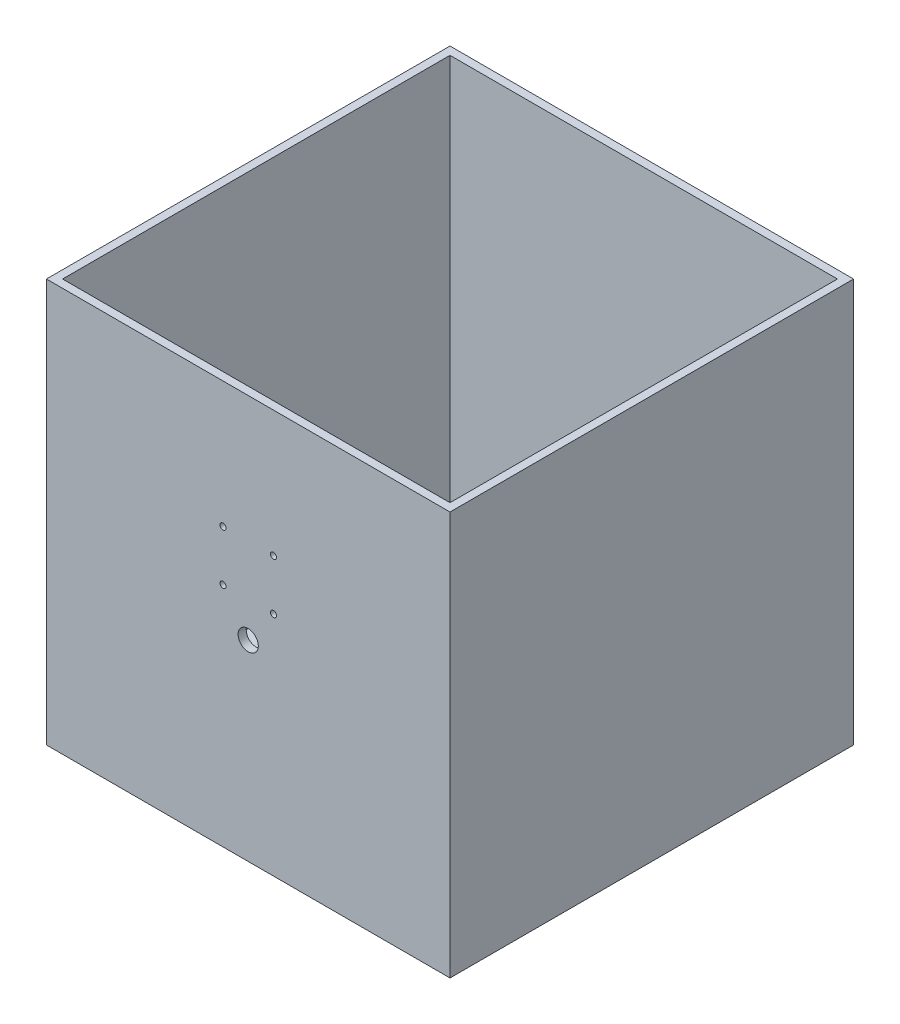
ISO-10303-21;
HEADER;
FILE_DESCRIPTION(('STEP AP214'),'2;1');
FILE_NAME('part.step','',(''),(''),'','','');
FILE_SCHEMA(('AUTOMOTIVE_DESIGN { 1 0 10303 214 1 1 1 1 }'));
ENDSEC;
DATA;
#1=APPLICATION_CONTEXT('core data for automotive mechanical design processes');
#2=APPLICATION_PROTOCOL_DEFINITION('international standard','automotive_design',2000,#1);
#3=PRODUCT_CONTEXT('',#1,'mechanical');
#4=PRODUCT('Part','Part','',(#3));
#5=PRODUCT_RELATED_PRODUCT_CATEGORY('part','',(#4));
#6=PRODUCT_DEFINITION_FORMATION('','',#4);
#7=PRODUCT_DEFINITION_CONTEXT('part definition',#1,'design');
#8=PRODUCT_DEFINITION('design','',#6,#7);
#9=PRODUCT_DEFINITION_SHAPE('','',#8);
#10=(LENGTH_UNIT() NAMED_UNIT(*) SI_UNIT(.MILLI.,.METRE.));
#11=(NAMED_UNIT(*) PLANE_ANGLE_UNIT() SI_UNIT($,.RADIAN.));
#12=(NAMED_UNIT(*) SI_UNIT($,.STERADIAN.) SOLID_ANGLE_UNIT());
#13=UNCERTAINTY_MEASURE_WITH_UNIT(LENGTH_MEASURE(1.E-05),#10,'distance_accuracy_value','');
#14=(GEOMETRIC_REPRESENTATION_CONTEXT(3) GLOBAL_UNCERTAINTY_ASSIGNED_CONTEXT((#13)) GLOBAL_UNIT_ASSIGNED_CONTEXT((#10,
#11,#12)) REPRESENTATION_CONTEXT('',''));
#15=CARTESIAN_POINT('',(0.,0.,0.));
#16=DIRECTION('',(0.,0.,1.));
#17=DIRECTION('',(1.,0.,0.));
#18=AXIS2_PLACEMENT_3D('',#15,#16,#17);
#19=CARTESIAN_POINT('',(0.,200.,0.));
#20=DIRECTION('',(0.,-1.,0.));
#21=DIRECTION('',(0.,0.,-1.));
#22=AXIS2_PLACEMENT_3D('',#19,#20,#21);
#23=PLANE('',#22);
#24=DIRECTION('',(0.,0.,-1.));
#25=VECTOR('',#24,1.);
#26=CARTESIAN_POINT('',(100.,200.,100.));
#27=LINE('',#26,#25);
#28=CARTESIAN_POINT('',(100.,200.,100.));
#29=VERTEX_POINT('',#28);
#30=CARTESIAN_POINT('',(100.,200.,-100.));
#31=VERTEX_POINT('',#30);
#32=EDGE_CURVE('E141',#29,#31,#27,.T.);
#33=ORIENTED_EDGE('',*,*,#32,.T.);
#34=DIRECTION('',(-1.,0.,0.));
#35=VECTOR('',#34,1.);
#36=CARTESIAN_POINT('',(-100.,200.,-100.));
#37=LINE('',#36,#35);
#38=CARTESIAN_POINT('',(-100.,200.,-100.));
#39=VERTEX_POINT('',#38);
#40=EDGE_CURVE('E85',#31,#39,#37,.T.);
#41=ORIENTED_EDGE('',*,*,#40,.T.);
#42=DIRECTION('',(0.,0.,1.));
#43=VECTOR('',#42,1.);
#44=CARTESIAN_POINT('',(-100.,200.,100.));
#45=LINE('',#44,#43);
#46=CARTESIAN_POINT('',(-100.,200.,100.));
#47=VERTEX_POINT('',#46);
#48=EDGE_CURVE('E144',#39,#47,#45,.T.);
#49=ORIENTED_EDGE('',*,*,#48,.T.);
#50=DIRECTION('',(1.,0.,0.));
#51=VECTOR('',#50,1.);
#52=CARTESIAN_POINT('',(-100.,200.,100.));
#53=LINE('',#52,#51);
#54=EDGE_CURVE('E57',#47,#29,#53,.T.);
#55=ORIENTED_EDGE('',*,*,#54,.T.);
#56=EDGE_LOOP('',(#33,#41,#49,#55));
#57=FACE_BOUND('',#56,.T.);
#58=DIRECTION('',(0.,0.,-1.));
#59=VECTOR('',#58,1.);
#60=CARTESIAN_POINT('',(96.,200.,0.));
#61=LINE('',#60,#59);
#62=CARTESIAN_POINT('',(96.,200.,96.));
#63=VERTEX_POINT('',#62);
#64=CARTESIAN_POINT('',(96.,200.,-96.));
#65=VERTEX_POINT('',#64);
#66=EDGE_CURVE('E130',#63,#65,#61,.T.);
#67=ORIENTED_EDGE('',*,*,#66,.F.);
#68=DIRECTION('',(1.,0.,0.));
#69=VECTOR('',#68,1.);
#70=CARTESIAN_POINT('',(0.,200.,96.));
#71=LINE('',#70,#69);
#72=CARTESIAN_POINT('',(-96.,200.,96.));
#73=VERTEX_POINT('',#72);
#74=EDGE_CURVE('E139',#73,#63,#71,.T.);
#75=ORIENTED_EDGE('',*,*,#74,.F.);
#76=DIRECTION('',(0.,0.,1.));
#77=VECTOR('',#76,1.);
#78=CARTESIAN_POINT('',(-96.,200.,0.));
#79=LINE('',#78,#77);
#80=CARTESIAN_POINT('',(-96.,200.,-96.));
#81=VERTEX_POINT('',#80);
#82=EDGE_CURVE('E137',#81,#73,#79,.T.);
#83=ORIENTED_EDGE('',*,*,#82,.F.);
#84=DIRECTION('',(-1.,0.,0.));
#85=VECTOR('',#84,1.);
#86=CARTESIAN_POINT('',(0.,200.,-96.));
#87=LINE('',#86,#85);
#88=EDGE_CURVE('E122',#65,#81,#87,.T.);
#89=ORIENTED_EDGE('',*,*,#88,.F.);
#90=EDGE_LOOP('',(#67,#75,#83,#89));
#91=FACE_BOUND('',#90,.T.);
#92=ADVANCED_FACE('F33',(#57,#91),#23,.F.);
#93=CARTESIAN_POINT('',(100.,200.,100.));
#94=DIRECTION('',(-1.,0.,0.));
#95=DIRECTION('',(0.,0.,1.));
#96=AXIS2_PLACEMENT_3D('',#93,#94,#95);
#97=PLANE('',#96);
#98=DIRECTION('',(0.,0.,-1.));
#99=VECTOR('',#98,1.);
#100=CARTESIAN_POINT('',(100.,0.,100.));
#101=LINE('',#100,#99);
#102=CARTESIAN_POINT('',(100.,0.,100.));
#103=VERTEX_POINT('',#102);
#104=CARTESIAN_POINT('',(100.,0.,-100.));
#105=VERTEX_POINT('',#104);
#106=EDGE_CURVE('E148',#103,#105,#101,.T.);
#107=ORIENTED_EDGE('',*,*,#106,.T.);
#108=DIRECTION('',(0.,-1.,0.));
#109=VECTOR('',#108,1.);
#110=CARTESIAN_POINT('',(100.,200.,-100.));
#111=LINE('',#110,#109);
#112=EDGE_CURVE('E11',#31,#105,#111,.T.);
#113=ORIENTED_EDGE('',*,*,#112,.F.);
#114=ORIENTED_EDGE('',*,*,#32,.F.);
#115=DIRECTION('',(0.,-1.,0.));
#116=VECTOR('',#115,1.);
#117=CARTESIAN_POINT('',(100.,200.,100.));
#118=LINE('',#117,#116);
#119=EDGE_CURVE('E147',#29,#103,#118,.T.);
#120=ORIENTED_EDGE('',*,*,#119,.T.);
#121=EDGE_LOOP('',(#107,#113,#114,#120));
#122=FACE_BOUND('',#121,.T.);
#123=ADVANCED_FACE('F35',(#122),#97,.F.);
#124=CARTESIAN_POINT('',(-100.,200.,-100.));
#125=DIRECTION('',(0.,0.,1.));
#126=DIRECTION('',(1.,0.,0.));
#127=AXIS2_PLACEMENT_3D('',#124,#125,#126);
#128=PLANE('',#127);
#129=DIRECTION('',(-1.,0.,0.));
#130=VECTOR('',#129,1.);
#131=CARTESIAN_POINT('',(-100.,0.,-100.));
#132=LINE('',#131,#130);
#133=CARTESIAN_POINT('',(-100.,0.,-100.));
#134=VERTEX_POINT('',#133);
#135=EDGE_CURVE('E151',#105,#134,#132,.T.);
#136=ORIENTED_EDGE('',*,*,#135,.T.);
#137=DIRECTION('',(0.,-1.,0.));
#138=VECTOR('',#137,1.);
#139=CARTESIAN_POINT('',(-100.,200.,-100.));
#140=LINE('',#139,#138);
#141=EDGE_CURVE('E41',#39,#134,#140,.T.);
#142=ORIENTED_EDGE('',*,*,#141,.F.);
#143=ORIENTED_EDGE('',*,*,#40,.F.);
#144=ORIENTED_EDGE('',*,*,#112,.T.);
#145=EDGE_LOOP('',(#136,#142,#143,#144));
#146=FACE_BOUND('',#145,.T.);
#147=ADVANCED_FACE('F182',(#146),#128,.F.);
#148=CARTESIAN_POINT('',(-100.,200.,100.));
#149=DIRECTION('',(1.,0.,0.));
#150=DIRECTION('',(0.,0.,-1.));
#151=AXIS2_PLACEMENT_3D('',#148,#149,#150);
#152=PLANE('',#151);
#153=DIRECTION('',(0.,0.,1.));
#154=VECTOR('',#153,1.);
#155=CARTESIAN_POINT('',(-100.,0.,100.));
#156=LINE('',#155,#154);
#157=CARTESIAN_POINT('',(-100.,0.,100.));
#158=VERTEX_POINT('',#157);
#159=EDGE_CURVE('E153',#134,#158,#156,.T.);
#160=ORIENTED_EDGE('',*,*,#159,.T.);
#161=DIRECTION('',(0.,-1.,0.));
#162=VECTOR('',#161,1.);
#163=CARTESIAN_POINT('',(-100.,200.,100.));
#164=LINE('',#163,#162);
#165=EDGE_CURVE('E157',#47,#158,#164,.T.);
#166=ORIENTED_EDGE('',*,*,#165,.F.);
#167=ORIENTED_EDGE('',*,*,#48,.F.);
#168=ORIENTED_EDGE('',*,*,#141,.T.);
#169=EDGE_LOOP('',(#160,#166,#167,#168));
#170=FACE_BOUND('',#169,.T.);
#171=ADVANCED_FACE('F162',(#170),#152,.F.);
#172=CARTESIAN_POINT('',(-100.,200.,100.));
#173=DIRECTION('',(0.,0.,-1.));
#174=DIRECTION('',(-1.,0.,0.));
#175=AXIS2_PLACEMENT_3D('',#172,#173,#174);
#176=PLANE('',#175);
#177=CARTESIAN_POINT('',(0.,95.,100.));
#178=DIRECTION('',(0.,0.,1.));
#179=DIRECTION('',(1.,0.,0.));
#180=AXIS2_PLACEMENT_3D('',#177,#178,#179);
#181=CIRCLE('',#180,5.);
#182=CARTESIAN_POINT('',(5.,95.,100.));
#183=VERTEX_POINT('',#182);
#184=EDGE_CURVE('E231',#183,#183,#181,.T.);
#185=ORIENTED_EDGE('',*,*,#184,.F.);
#186=EDGE_LOOP('',(#185));
#187=FACE_BOUND('',#186,.T.);
#188=CARTESIAN_POINT('',(-12.5,112.5,100.));
#189=DIRECTION('',(0.,0.,1.));
#190=DIRECTION('',(1.,0.,0.));
#191=AXIS2_PLACEMENT_3D('',#188,#189,#190);
#192=CIRCLE('',#191,1.5);
#193=CARTESIAN_POINT('',(-11.,112.5,100.));
#194=VERTEX_POINT('',#193);
#195=EDGE_CURVE('E235',#194,#194,#192,.T.);
#196=ORIENTED_EDGE('',*,*,#195,.F.);
#197=EDGE_LOOP('',(#196));
#198=FACE_BOUND('',#197,.T.);
#199=CARTESIAN_POINT('',(12.5,112.5,100.));
#200=DIRECTION('',(0.,0.,1.));
#201=DIRECTION('',(1.,0.,0.));
#202=AXIS2_PLACEMENT_3D('',#199,#200,#201);
#203=CIRCLE('',#202,1.5);
#204=CARTESIAN_POINT('',(14.,112.5,100.));
#205=VERTEX_POINT('',#204);
#206=EDGE_CURVE('E242',#205,#205,#203,.T.);
#207=ORIENTED_EDGE('',*,*,#206,.F.);
#208=EDGE_LOOP('',(#207));
#209=FACE_BOUND('',#208,.T.);
#210=CARTESIAN_POINT('',(12.5,137.5,100.));
#211=DIRECTION('',(0.,0.,1.));
#212=DIRECTION('',(1.,0.,0.));
#213=AXIS2_PLACEMENT_3D('',#210,#211,#212);
#214=CIRCLE('',#213,1.5);
#215=CARTESIAN_POINT('',(14.,137.5,100.));
#216=VERTEX_POINT('',#215);
#217=EDGE_CURVE('E248',#216,#216,#214,.T.);
#218=ORIENTED_EDGE('',*,*,#217,.F.);
#219=EDGE_LOOP('',(#218));
#220=FACE_BOUND('',#219,.T.);
#221=CARTESIAN_POINT('',(-12.5,137.5,100.));
#222=DIRECTION('',(0.,0.,1.));
#223=DIRECTION('',(1.,0.,0.));
#224=AXIS2_PLACEMENT_3D('',#221,#222,#223);
#225=CIRCLE('',#224,1.5);
#226=CARTESIAN_POINT('',(-11.,137.5,100.));
#227=VERTEX_POINT('',#226);
#228=EDGE_CURVE('E254',#227,#227,#225,.T.);
#229=ORIENTED_EDGE('',*,*,#228,.F.);
#230=EDGE_LOOP('',(#229));
#231=FACE_BOUND('',#230,.T.);
#232=DIRECTION('',(1.,0.,0.));
#233=VECTOR('',#232,1.);
#234=CARTESIAN_POINT('',(-100.,0.,100.));
#235=LINE('',#234,#233);
#236=EDGE_CURVE('E78',#158,#103,#235,.T.);
#237=ORIENTED_EDGE('',*,*,#236,.T.);
#238=ORIENTED_EDGE('',*,*,#119,.F.);
#239=ORIENTED_EDGE('',*,*,#54,.F.);
#240=ORIENTED_EDGE('',*,*,#165,.T.);
#241=EDGE_LOOP('',(#237,#238,#239,#240));
#242=FACE_BOUND('',#241,.T.);
#243=ADVANCED_FACE('F170',(#187,#198,#209,#220,#231,#242),#176,.F.);
#244=CARTESIAN_POINT('',(0.,0.,0.));
#245=DIRECTION('',(0.,-1.,0.));
#246=DIRECTION('',(0.,0.,-1.));
#247=AXIS2_PLACEMENT_3D('',#244,#245,#246);
#248=PLANE('',#247);
#249=ORIENTED_EDGE('',*,*,#106,.F.);
#250=ORIENTED_EDGE('',*,*,#236,.F.);
#251=ORIENTED_EDGE('',*,*,#159,.F.);
#252=ORIENTED_EDGE('',*,*,#135,.F.);
#253=EDGE_LOOP('',(#249,#250,#251,#252));
#254=FACE_BOUND('',#253,.T.);
#255=ADVANCED_FACE('F166',(#254),#248,.T.);
#256=CARTESIAN_POINT('',(96.,200.,100.));
#257=DIRECTION('',(-1.,0.,0.));
#258=DIRECTION('',(0.,0.,1.));
#259=AXIS2_PLACEMENT_3D('',#256,#257,#258);
#260=PLANE('',#259);
#261=DIRECTION('',(0.,0.,-1.));
#262=VECTOR('',#261,1.);
#263=CARTESIAN_POINT('',(96.,4.,0.));
#264=LINE('',#263,#262);
#265=CARTESIAN_POINT('',(96.,4.,96.));
#266=VERTEX_POINT('',#265);
#267=CARTESIAN_POINT('',(96.,4.,-96.));
#268=VERTEX_POINT('',#267);
#269=EDGE_CURVE('E113',#266,#268,#264,.T.);
#270=ORIENTED_EDGE('',*,*,#269,.F.);
#271=DIRECTION('',(0.,-1.,0.));
#272=VECTOR('',#271,1.);
#273=CARTESIAN_POINT('',(96.,200.,96.));
#274=LINE('',#273,#272);
#275=EDGE_CURVE('E133',#63,#266,#274,.T.);
#276=ORIENTED_EDGE('',*,*,#275,.F.);
#277=ORIENTED_EDGE('',*,*,#66,.T.);
#278=DIRECTION('',(0.,-1.,0.));
#279=VECTOR('',#278,1.);
#280=CARTESIAN_POINT('',(96.,200.,-96.));
#281=LINE('',#280,#279);
#282=EDGE_CURVE('E125',#65,#268,#281,.T.);
#283=ORIENTED_EDGE('',*,*,#282,.T.);
#284=EDGE_LOOP('',(#270,#276,#277,#283));
#285=FACE_BOUND('',#284,.T.);
#286=ADVANCED_FACE('F179',(#285),#260,.T.);
#287=CARTESIAN_POINT('',(-100.,200.,-96.));
#288=DIRECTION('',(0.,0.,1.));
#289=DIRECTION('',(1.,0.,0.));
#290=AXIS2_PLACEMENT_3D('',#287,#288,#289);
#291=PLANE('',#290);
#292=DIRECTION('',(-1.,0.,0.));
#293=VECTOR('',#292,1.);
#294=CARTESIAN_POINT('',(0.,4.,-96.));
#295=LINE('',#294,#293);
#296=CARTESIAN_POINT('',(-96.,4.,-96.));
#297=VERTEX_POINT('',#296);
#298=EDGE_CURVE('E107',#268,#297,#295,.T.);
#299=ORIENTED_EDGE('',*,*,#298,.F.);
#300=ORIENTED_EDGE('',*,*,#282,.F.);
#301=ORIENTED_EDGE('',*,*,#88,.T.);
#302=DIRECTION('',(0.,-1.,0.));
#303=VECTOR('',#302,1.);
#304=CARTESIAN_POINT('',(-96.,200.,-96.));
#305=LINE('',#304,#303);
#306=EDGE_CURVE('E119',#81,#297,#305,.T.);
#307=ORIENTED_EDGE('',*,*,#306,.T.);
#308=EDGE_LOOP('',(#299,#300,#301,#307));
#309=FACE_BOUND('',#308,.T.);
#310=ADVANCED_FACE('F120',(#309),#291,.T.);
#311=CARTESIAN_POINT('',(-96.,200.,100.));
#312=DIRECTION('',(1.,0.,0.));
#313=DIRECTION('',(0.,0.,-1.));
#314=AXIS2_PLACEMENT_3D('',#311,#312,#313);
#315=PLANE('',#314);
#316=DIRECTION('',(0.,0.,1.));
#317=VECTOR('',#316,1.);
#318=CARTESIAN_POINT('',(-96.,4.,0.));
#319=LINE('',#318,#317);
#320=CARTESIAN_POINT('',(-96.,4.,96.));
#321=VERTEX_POINT('',#320);
#322=EDGE_CURVE('E111',#297,#321,#319,.T.);
#323=ORIENTED_EDGE('',*,*,#322,.F.);
#324=ORIENTED_EDGE('',*,*,#306,.F.);
#325=ORIENTED_EDGE('',*,*,#82,.T.);
#326=DIRECTION('',(0.,-1.,0.));
#327=VECTOR('',#326,1.);
#328=CARTESIAN_POINT('',(-96.,200.,96.));
#329=LINE('',#328,#327);
#330=EDGE_CURVE('E48',#73,#321,#329,.T.);
#331=ORIENTED_EDGE('',*,*,#330,.T.);
#332=EDGE_LOOP('',(#323,#324,#325,#331));
#333=FACE_BOUND('',#332,.T.);
#334=ADVANCED_FACE('F127',(#333),#315,.T.);
#335=CARTESIAN_POINT('',(-100.,200.,96.));
#336=DIRECTION('',(0.,0.,-1.));
#337=DIRECTION('',(-1.,0.,0.));
#338=AXIS2_PLACEMENT_3D('',#335,#336,#337);
#339=PLANE('',#338);
#340=CARTESIAN_POINT('',(0.,95.,96.));
#341=DIRECTION('',(0.,0.,-1.));
#342=DIRECTION('',(-1.,0.,0.));
#343=AXIS2_PLACEMENT_3D('',#340,#341,#342);
#344=CIRCLE('',#343,5.);
#345=CARTESIAN_POINT('',(5.,95.,96.));
#346=VERTEX_POINT('',#345);
#347=EDGE_CURVE('E229',#346,#346,#344,.F.);
#348=ORIENTED_EDGE('',*,*,#347,.T.);
#349=EDGE_LOOP('',(#348));
#350=FACE_BOUND('',#349,.T.);
#351=CARTESIAN_POINT('',(-12.5,112.5,96.));
#352=DIRECTION('',(0.,0.,-1.));
#353=DIRECTION('',(-1.,0.,0.));
#354=AXIS2_PLACEMENT_3D('',#351,#352,#353);
#355=CIRCLE('',#354,1.5);
#356=CARTESIAN_POINT('',(-11.,112.5,96.));
#357=VERTEX_POINT('',#356);
#358=EDGE_CURVE('E232',#357,#357,#355,.F.);
#359=ORIENTED_EDGE('',*,*,#358,.T.);
#360=EDGE_LOOP('',(#359));
#361=FACE_BOUND('',#360,.T.);
#362=CARTESIAN_POINT('',(12.5,112.5,96.));
#363=DIRECTION('',(0.,0.,-1.));
#364=DIRECTION('',(-1.,0.,0.));
#365=AXIS2_PLACEMENT_3D('',#362,#363,#364);
#366=CIRCLE('',#365,1.5);
#367=CARTESIAN_POINT('',(14.,112.5,96.));
#368=VERTEX_POINT('',#367);
#369=EDGE_CURVE('E240',#368,#368,#366,.F.);
#370=ORIENTED_EDGE('',*,*,#369,.T.);
#371=EDGE_LOOP('',(#370));
#372=FACE_BOUND('',#371,.T.);
#373=CARTESIAN_POINT('',(12.5,137.5,96.));
#374=DIRECTION('',(0.,0.,-1.));
#375=DIRECTION('',(-1.,0.,0.));
#376=AXIS2_PLACEMENT_3D('',#373,#374,#375);
#377=CIRCLE('',#376,1.5);
#378=CARTESIAN_POINT('',(14.,137.5,96.));
#379=VERTEX_POINT('',#378);
#380=EDGE_CURVE('E245',#379,#379,#377,.F.);
#381=ORIENTED_EDGE('',*,*,#380,.T.);
#382=EDGE_LOOP('',(#381));
#383=FACE_BOUND('',#382,.T.);
#384=CARTESIAN_POINT('',(-12.5,137.5,96.));
#385=DIRECTION('',(0.,0.,-1.));
#386=DIRECTION('',(-1.,0.,0.));
#387=AXIS2_PLACEMENT_3D('',#384,#385,#386);
#388=CIRCLE('',#387,1.5);
#389=CARTESIAN_POINT('',(-11.,137.5,96.));
#390=VERTEX_POINT('',#389);
#391=EDGE_CURVE('E251',#390,#390,#388,.F.);
#392=ORIENTED_EDGE('',*,*,#391,.T.);
#393=EDGE_LOOP('',(#392));
#394=FACE_BOUND('',#393,.T.);
#395=DIRECTION('',(1.,0.,0.));
#396=VECTOR('',#395,1.);
#397=CARTESIAN_POINT('',(0.,4.,96.));
#398=LINE('',#397,#396);
#399=EDGE_CURVE('E128',#321,#266,#398,.T.);
#400=ORIENTED_EDGE('',*,*,#399,.F.);
#401=ORIENTED_EDGE('',*,*,#330,.F.);
#402=ORIENTED_EDGE('',*,*,#74,.T.);
#403=ORIENTED_EDGE('',*,*,#275,.T.);
#404=EDGE_LOOP('',(#400,#401,#402,#403));
#405=FACE_BOUND('',#404,.T.);
#406=ADVANCED_FACE('F196',(#350,#361,#372,#383,#394,#405),#339,.T.);
#407=CARTESIAN_POINT('',(0.,4.,0.));
#408=DIRECTION('',(0.,-1.,0.));
#409=DIRECTION('',(0.,0.,-1.));
#410=AXIS2_PLACEMENT_3D('',#407,#408,#409);
#411=PLANE('',#410);
#412=ORIENTED_EDGE('',*,*,#269,.T.);
#413=ORIENTED_EDGE('',*,*,#298,.T.);
#414=ORIENTED_EDGE('',*,*,#322,.T.);
#415=ORIENTED_EDGE('',*,*,#399,.T.);
#416=EDGE_LOOP('',(#412,#413,#414,#415));
#417=FACE_BOUND('',#416,.T.);
#418=ADVANCED_FACE('F109',(#417),#411,.F.);
#419=CARTESIAN_POINT('',(-12.5,137.5,-100.001));
#420=DIRECTION('',(0.,0.,1.));
#421=DIRECTION('',(1.,0.,0.));
#422=AXIS2_PLACEMENT_3D('',#419,#420,#421);
#423=CYLINDRICAL_SURFACE('',#422,1.5);
#424=CARTESIAN_POINT('',(-11.,137.5,96.));
#425=CARTESIAN_POINT('',(-11.,137.5,96.0416666666667));
#426=CARTESIAN_POINT('',(-11.,137.5,96.0833333333333));
#427=CARTESIAN_POINT('',(-11.,137.5,96.1666666666667));
#428=CARTESIAN_POINT('',(-11.,137.5,96.2083333333333));
#429=CARTESIAN_POINT('',(-11.,137.5,96.2916666666667));
#430=CARTESIAN_POINT('',(-11.,137.5,96.3333333333333));
#431=CARTESIAN_POINT('',(-11.,137.5,96.4166666666667));
#432=CARTESIAN_POINT('',(-11.,137.5,96.4583333333333));
#433=CARTESIAN_POINT('',(-11.,137.5,96.5416666666667));
#434=CARTESIAN_POINT('',(-11.,137.5,96.5833333333333));
#435=CARTESIAN_POINT('',(-11.,137.5,96.6666666666667));
#436=CARTESIAN_POINT('',(-11.,137.5,96.7083333333333));
#437=CARTESIAN_POINT('',(-11.,137.5,96.7916666666667));
#438=CARTESIAN_POINT('',(-11.,137.5,96.8333333333333));
#439=CARTESIAN_POINT('',(-11.,137.5,96.9166666666667));
#440=CARTESIAN_POINT('',(-11.,137.5,96.9583333333333));
#441=CARTESIAN_POINT('',(-11.,137.5,97.0416666666667));
#442=CARTESIAN_POINT('',(-11.,137.5,97.0833333333333));
#443=CARTESIAN_POINT('',(-11.,137.5,97.1666666666667));
#444=CARTESIAN_POINT('',(-11.,137.5,97.2083333333333));
#445=CARTESIAN_POINT('',(-11.,137.5,97.2916666666667));
#446=CARTESIAN_POINT('',(-11.,137.5,97.3333333333333));
#447=CARTESIAN_POINT('',(-11.,137.5,97.4166666666667));
#448=CARTESIAN_POINT('',(-11.,137.5,97.4583333333333));
#449=CARTESIAN_POINT('',(-11.,137.5,97.5416666666667));
#450=CARTESIAN_POINT('',(-11.,137.5,97.5833333333333));
#451=CARTESIAN_POINT('',(-11.,137.5,97.6666666666667));
#452=CARTESIAN_POINT('',(-11.,137.5,97.7083333333333));
#453=CARTESIAN_POINT('',(-11.,137.5,97.7916666666667));
#454=CARTESIAN_POINT('',(-11.,137.5,97.8333333333333));
#455=CARTESIAN_POINT('',(-11.,137.5,97.9166666666667));
#456=CARTESIAN_POINT('',(-11.,137.5,97.9583333333333));
#457=CARTESIAN_POINT('',(-11.,137.5,98.0416666666667));
#458=CARTESIAN_POINT('',(-11.,137.5,98.0833333333333));
#459=CARTESIAN_POINT('',(-11.,137.5,98.1666666666667));
#460=CARTESIAN_POINT('',(-11.,137.5,98.2083333333333));
#461=CARTESIAN_POINT('',(-11.,137.5,98.2916666666667));
#462=CARTESIAN_POINT('',(-11.,137.5,98.3333333333333));
#463=CARTESIAN_POINT('',(-11.,137.5,98.4166666666667));
#464=CARTESIAN_POINT('',(-11.,137.5,98.4583333333333));
#465=CARTESIAN_POINT('',(-11.,137.5,98.5416666666667));
#466=CARTESIAN_POINT('',(-11.,137.5,98.5833333333333));
#467=CARTESIAN_POINT('',(-11.,137.5,98.6666666666667));
#468=CARTESIAN_POINT('',(-11.,137.5,98.7083333333333));
#469=CARTESIAN_POINT('',(-11.,137.5,98.7916666666667));
#470=CARTESIAN_POINT('',(-11.,137.5,98.8333333333333));
#471=CARTESIAN_POINT('',(-11.,137.5,98.9166666666667));
#472=CARTESIAN_POINT('',(-11.,137.5,98.9583333333333));
#473=CARTESIAN_POINT('',(-11.,137.5,99.0416666666667));
#474=CARTESIAN_POINT('',(-11.,137.5,99.0833333333333));
#475=CARTESIAN_POINT('',(-11.,137.5,99.1666666666667));
#476=CARTESIAN_POINT('',(-11.,137.5,99.2083333333333));
#477=CARTESIAN_POINT('',(-11.,137.5,99.2916666666667));
#478=CARTESIAN_POINT('',(-11.,137.5,99.3333333333333));
#479=CARTESIAN_POINT('',(-11.,137.5,99.4166666666667));
#480=CARTESIAN_POINT('',(-11.,137.5,99.4583333333333));
#481=CARTESIAN_POINT('',(-11.,137.5,99.5416666666667));
#482=CARTESIAN_POINT('',(-11.,137.5,99.5833333333333));
#483=CARTESIAN_POINT('',(-11.,137.5,99.6666666666667));
#484=CARTESIAN_POINT('',(-11.,137.5,99.7083333333333));
#485=CARTESIAN_POINT('',(-11.,137.5,99.7916666666667));
#486=CARTESIAN_POINT('',(-11.,137.5,99.8333333333333));
#487=CARTESIAN_POINT('',(-11.,137.5,99.9166666666667));
#488=CARTESIAN_POINT('',(-11.,137.5,99.9583333333333));
#489=CARTESIAN_POINT('',(-11.,137.5,100.));
#490=B_SPLINE_CURVE_WITH_KNOTS('',3,(#424,#425,#426,#427,#428,#429,#430,#431,#432,#433,#434,
#435,#436,#437,#438,#439,#440,#441,#442,#443,#444,#445,#446,#447,#448,#449,#450,#451,#452,#453,
#454,#455,#456,#457,#458,#459,#460,#461,#462,#463,#464,#465,#466,#467,#468,#469,#470,#471,#472,
#473,#474,#475,#476,#477,#478,#479,#480,#481,#482,#483,#484,#485,#486,#487,#488,#489),
.UNSPECIFIED.,.F.,.F.,(4,2,2,2,2,2,2,2,2,2,2,2,2,2,2,2,2,2,2,2,2,2,2,2,2,2,2,2,2,2,2,2,4),(0.,
0.124999999999986,0.25,0.375000000000014,0.5,0.624999999999987,0.750000000000001,
0.875000000000015,1.,1.12499999999999,1.25,1.37500000000002,1.5,1.62499999999999,1.75,
1.87500000000002,2.,2.12499999999999,2.25,2.37500000000002,2.5,2.62499999999999,2.75,
2.87500000000002,3.,3.12499999999999,3.25,3.37500000000002,3.5,3.62499999999999,3.75,
3.87500000000002,4.),.UNSPECIFIED.);
#491=EDGE_CURVE('BSEAM195',#390,#227,#490,.T.);
#492=ORIENTED_EDGE('',*,*,#391,.F.);
#493=ORIENTED_EDGE('',*,*,#228,.T.);
#494=ORIENTED_EDGE('',*,*,#491,.T.);
#495=ORIENTED_EDGE('',*,*,#491,.F.);
#496=EDGE_LOOP('',(#492,#494,#493,#495));
#497=FACE_BOUND('',#496,.T.);
#498=ADVANCED_FACE('F195',(#497),#423,.F.);
#499=CARTESIAN_POINT('',(12.5,137.5,-100.001));
#500=DIRECTION('',(0.,0.,1.));
#501=DIRECTION('',(1.,0.,0.));
#502=AXIS2_PLACEMENT_3D('',#499,#500,#501);
#503=CYLINDRICAL_SURFACE('',#502,1.5);
#504=CARTESIAN_POINT('',(14.,137.5,96.));
#505=CARTESIAN_POINT('',(14.,137.5,96.0416666666667));
#506=CARTESIAN_POINT('',(14.,137.5,96.0833333333333));
#507=CARTESIAN_POINT('',(14.,137.5,96.1666666666667));
#508=CARTESIAN_POINT('',(14.,137.5,96.2083333333333));
#509=CARTESIAN_POINT('',(14.,137.5,96.2916666666667));
#510=CARTESIAN_POINT('',(14.,137.5,96.3333333333333));
#511=CARTESIAN_POINT('',(14.,137.5,96.4166666666667));
#512=CARTESIAN_POINT('',(14.,137.5,96.4583333333333));
#513=CARTESIAN_POINT('',(14.,137.5,96.5416666666667));
#514=CARTESIAN_POINT('',(14.,137.5,96.5833333333333));
#515=CARTESIAN_POINT('',(14.,137.5,96.6666666666667));
#516=CARTESIAN_POINT('',(14.,137.5,96.7083333333333));
#517=CARTESIAN_POINT('',(14.,137.5,96.7916666666667));
#518=CARTESIAN_POINT('',(14.,137.5,96.8333333333333));
#519=CARTESIAN_POINT('',(14.,137.5,96.9166666666667));
#520=CARTESIAN_POINT('',(14.,137.5,96.9583333333333));
#521=CARTESIAN_POINT('',(14.,137.5,97.0416666666667));
#522=CARTESIAN_POINT('',(14.,137.5,97.0833333333333));
#523=CARTESIAN_POINT('',(14.,137.5,97.1666666666667));
#524=CARTESIAN_POINT('',(14.,137.5,97.2083333333333));
#525=CARTESIAN_POINT('',(14.,137.5,97.2916666666667));
#526=CARTESIAN_POINT('',(14.,137.5,97.3333333333333));
#527=CARTESIAN_POINT('',(14.,137.5,97.4166666666667));
#528=CARTESIAN_POINT('',(14.,137.5,97.4583333333333));
#529=CARTESIAN_POINT('',(14.,137.5,97.5416666666667));
#530=CARTESIAN_POINT('',(14.,137.5,97.5833333333333));
#531=CARTESIAN_POINT('',(14.,137.5,97.6666666666667));
#532=CARTESIAN_POINT('',(14.,137.5,97.7083333333333));
#533=CARTESIAN_POINT('',(14.,137.5,97.7916666666667));
#534=CARTESIAN_POINT('',(14.,137.5,97.8333333333333));
#535=CARTESIAN_POINT('',(14.,137.5,97.9166666666667));
#536=CARTESIAN_POINT('',(14.,137.5,97.9583333333333));
#537=CARTESIAN_POINT('',(14.,137.5,98.0416666666667));
#538=CARTESIAN_POINT('',(14.,137.5,98.0833333333333));
#539=CARTESIAN_POINT('',(14.,137.5,98.1666666666667));
#540=CARTESIAN_POINT('',(14.,137.5,98.2083333333333));
#541=CARTESIAN_POINT('',(14.,137.5,98.2916666666667));
#542=CARTESIAN_POINT('',(14.,137.5,98.3333333333333));
#543=CARTESIAN_POINT('',(14.,137.5,98.4166666666667));
#544=CARTESIAN_POINT('',(14.,137.5,98.4583333333333));
#545=CARTESIAN_POINT('',(14.,137.5,98.5416666666667));
#546=CARTESIAN_POINT('',(14.,137.5,98.5833333333333));
#547=CARTESIAN_POINT('',(14.,137.5,98.6666666666667));
#548=CARTESIAN_POINT('',(14.,137.5,98.7083333333333));
#549=CARTESIAN_POINT('',(14.,137.5,98.7916666666667));
#550=CARTESIAN_POINT('',(14.,137.5,98.8333333333333));
#551=CARTESIAN_POINT('',(14.,137.5,98.9166666666667));
#552=CARTESIAN_POINT('',(14.,137.5,98.9583333333333));
#553=CARTESIAN_POINT('',(14.,137.5,99.0416666666667));
#554=CARTESIAN_POINT('',(14.,137.5,99.0833333333333));
#555=CARTESIAN_POINT('',(14.,137.5,99.1666666666667));
#556=CARTESIAN_POINT('',(14.,137.5,99.2083333333333));
#557=CARTESIAN_POINT('',(14.,137.5,99.2916666666667));
#558=CARTESIAN_POINT('',(14.,137.5,99.3333333333333));
#559=CARTESIAN_POINT('',(14.,137.5,99.4166666666667));
#560=CARTESIAN_POINT('',(14.,137.5,99.4583333333333));
#561=CARTESIAN_POINT('',(14.,137.5,99.5416666666667));
#562=CARTESIAN_POINT('',(14.,137.5,99.5833333333333));
#563=CARTESIAN_POINT('',(14.,137.5,99.6666666666667));
#564=CARTESIAN_POINT('',(14.,137.5,99.7083333333333));
#565=CARTESIAN_POINT('',(14.,137.5,99.7916666666667));
#566=CARTESIAN_POINT('',(14.,137.5,99.8333333333333));
#567=CARTESIAN_POINT('',(14.,137.5,99.9166666666667));
#568=CARTESIAN_POINT('',(14.,137.5,99.9583333333333));
#569=CARTESIAN_POINT('',(14.,137.5,100.));
#570=B_SPLINE_CURVE_WITH_KNOTS('',3,(#504,#505,#506,#507,#508,#509,#510,#511,#512,#513,#514,
#515,#516,#517,#518,#519,#520,#521,#522,#523,#524,#525,#526,#527,#528,#529,#530,#531,#532,#533,
#534,#535,#536,#537,#538,#539,#540,#541,#542,#543,#544,#545,#546,#547,#548,#549,#550,#551,#552,
#553,#554,#555,#556,#557,#558,#559,#560,#561,#562,#563,#564,#565,#566,#567,#568,#569),
.UNSPECIFIED.,.F.,.F.,(4,2,2,2,2,2,2,2,2,2,2,2,2,2,2,2,2,2,2,2,2,2,2,2,2,2,2,2,2,2,2,2,4),(0.,
0.124999999999986,0.25,0.375000000000014,0.5,0.624999999999987,0.750000000000001,
0.875000000000015,1.,1.12499999999999,1.25,1.37500000000002,1.5,1.62499999999999,1.75,
1.87500000000002,2.,2.12499999999999,2.25,2.37500000000002,2.5,2.62499999999999,2.75,
2.87500000000002,3.,3.12499999999999,3.25,3.37500000000002,3.5,3.62499999999999,3.75,
3.87500000000002,4.),.UNSPECIFIED.);
#571=EDGE_CURVE('BSEAM208',#379,#216,#570,.T.);
#572=ORIENTED_EDGE('',*,*,#380,.F.);
#573=ORIENTED_EDGE('',*,*,#217,.T.);
#574=ORIENTED_EDGE('',*,*,#571,.T.);
#575=ORIENTED_EDGE('',*,*,#571,.F.);
#576=EDGE_LOOP('',(#572,#574,#573,#575));
#577=FACE_BOUND('',#576,.T.);
#578=ADVANCED_FACE('F208',(#577),#503,.F.);
#579=CARTESIAN_POINT('',(12.5,112.5,-100.001));
#580=DIRECTION('',(0.,0.,1.));
#581=DIRECTION('',(1.,0.,0.));
#582=AXIS2_PLACEMENT_3D('',#579,#580,#581);
#583=CYLINDRICAL_SURFACE('',#582,1.5);
#584=CARTESIAN_POINT('',(14.,112.5,96.));
#585=CARTESIAN_POINT('',(14.,112.5,96.0416666666667));
#586=CARTESIAN_POINT('',(14.,112.5,96.0833333333333));
#587=CARTESIAN_POINT('',(14.,112.5,96.1666666666667));
#588=CARTESIAN_POINT('',(14.,112.5,96.2083333333333));
#589=CARTESIAN_POINT('',(14.,112.5,96.2916666666667));
#590=CARTESIAN_POINT('',(14.,112.5,96.3333333333333));
#591=CARTESIAN_POINT('',(14.,112.5,96.4166666666667));
#592=CARTESIAN_POINT('',(14.,112.5,96.4583333333333));
#593=CARTESIAN_POINT('',(14.,112.5,96.5416666666667));
#594=CARTESIAN_POINT('',(14.,112.5,96.5833333333333));
#595=CARTESIAN_POINT('',(14.,112.5,96.6666666666667));
#596=CARTESIAN_POINT('',(14.,112.5,96.7083333333333));
#597=CARTESIAN_POINT('',(14.,112.5,96.7916666666667));
#598=CARTESIAN_POINT('',(14.,112.5,96.8333333333333));
#599=CARTESIAN_POINT('',(14.,112.5,96.9166666666667));
#600=CARTESIAN_POINT('',(14.,112.5,96.9583333333333));
#601=CARTESIAN_POINT('',(14.,112.5,97.0416666666667));
#602=CARTESIAN_POINT('',(14.,112.5,97.0833333333333));
#603=CARTESIAN_POINT('',(14.,112.5,97.1666666666667));
#604=CARTESIAN_POINT('',(14.,112.5,97.2083333333333));
#605=CARTESIAN_POINT('',(14.,112.5,97.2916666666667));
#606=CARTESIAN_POINT('',(14.,112.5,97.3333333333333));
#607=CARTESIAN_POINT('',(14.,112.5,97.4166666666667));
#608=CARTESIAN_POINT('',(14.,112.5,97.4583333333333));
#609=CARTESIAN_POINT('',(14.,112.5,97.5416666666667));
#610=CARTESIAN_POINT('',(14.,112.5,97.5833333333333));
#611=CARTESIAN_POINT('',(14.,112.5,97.6666666666667));
#612=CARTESIAN_POINT('',(14.,112.5,97.7083333333333));
#613=CARTESIAN_POINT('',(14.,112.5,97.7916666666667));
#614=CARTESIAN_POINT('',(14.,112.5,97.8333333333333));
#615=CARTESIAN_POINT('',(14.,112.5,97.9166666666667));
#616=CARTESIAN_POINT('',(14.,112.5,97.9583333333333));
#617=CARTESIAN_POINT('',(14.,112.5,98.0416666666667));
#618=CARTESIAN_POINT('',(14.,112.5,98.0833333333333));
#619=CARTESIAN_POINT('',(14.,112.5,98.1666666666667));
#620=CARTESIAN_POINT('',(14.,112.5,98.2083333333333));
#621=CARTESIAN_POINT('',(14.,112.5,98.2916666666667));
#622=CARTESIAN_POINT('',(14.,112.5,98.3333333333333));
#623=CARTESIAN_POINT('',(14.,112.5,98.4166666666667));
#624=CARTESIAN_POINT('',(14.,112.5,98.4583333333333));
#625=CARTESIAN_POINT('',(14.,112.5,98.5416666666667));
#626=CARTESIAN_POINT('',(14.,112.5,98.5833333333333));
#627=CARTESIAN_POINT('',(14.,112.5,98.6666666666667));
#628=CARTESIAN_POINT('',(14.,112.5,98.7083333333333));
#629=CARTESIAN_POINT('',(14.,112.5,98.7916666666667));
#630=CARTESIAN_POINT('',(14.,112.5,98.8333333333333));
#631=CARTESIAN_POINT('',(14.,112.5,98.9166666666667));
#632=CARTESIAN_POINT('',(14.,112.5,98.9583333333333));
#633=CARTESIAN_POINT('',(14.,112.5,99.0416666666667));
#634=CARTESIAN_POINT('',(14.,112.5,99.0833333333333));
#635=CARTESIAN_POINT('',(14.,112.5,99.1666666666667));
#636=CARTESIAN_POINT('',(14.,112.5,99.2083333333333));
#637=CARTESIAN_POINT('',(14.,112.5,99.2916666666667));
#638=CARTESIAN_POINT('',(14.,112.5,99.3333333333333));
#639=CARTESIAN_POINT('',(14.,112.5,99.4166666666667));
#640=CARTESIAN_POINT('',(14.,112.5,99.4583333333333));
#641=CARTESIAN_POINT('',(14.,112.5,99.5416666666667));
#642=CARTESIAN_POINT('',(14.,112.5,99.5833333333333));
#643=CARTESIAN_POINT('',(14.,112.5,99.6666666666667));
#644=CARTESIAN_POINT('',(14.,112.5,99.7083333333333));
#645=CARTESIAN_POINT('',(14.,112.5,99.7916666666667));
#646=CARTESIAN_POINT('',(14.,112.5,99.8333333333333));
#647=CARTESIAN_POINT('',(14.,112.5,99.9166666666667));
#648=CARTESIAN_POINT('',(14.,112.5,99.9583333333333));
#649=CARTESIAN_POINT('',(14.,112.5,100.));
#650=B_SPLINE_CURVE_WITH_KNOTS('',3,(#584,#585,#586,#587,#588,#589,#590,#591,#592,#593,#594,
#595,#596,#597,#598,#599,#600,#601,#602,#603,#604,#605,#606,#607,#608,#609,#610,#611,#612,#613,
#614,#615,#616,#617,#618,#619,#620,#621,#622,#623,#624,#625,#626,#627,#628,#629,#630,#631,#632,
#633,#634,#635,#636,#637,#638,#639,#640,#641,#642,#643,#644,#645,#646,#647,#648,#649),
.UNSPECIFIED.,.F.,.F.,(4,2,2,2,2,2,2,2,2,2,2,2,2,2,2,2,2,2,2,2,2,2,2,2,2,2,2,2,2,2,2,2,4),(0.,
0.124999999999986,0.25,0.375000000000014,0.5,0.624999999999987,0.750000000000001,
0.875000000000015,1.,1.12499999999999,1.25,1.37500000000002,1.5,1.62499999999999,1.75,
1.87500000000002,2.,2.12499999999999,2.25,2.37500000000002,2.5,2.62499999999999,2.75,
2.87500000000002,3.,3.12499999999999,3.25,3.37500000000002,3.5,3.62499999999999,3.75,
3.87500000000002,4.),.UNSPECIFIED.);
#651=EDGE_CURVE('BSEAM212',#368,#205,#650,.T.);
#652=ORIENTED_EDGE('',*,*,#369,.F.);
#653=ORIENTED_EDGE('',*,*,#206,.T.);
#654=ORIENTED_EDGE('',*,*,#651,.T.);
#655=ORIENTED_EDGE('',*,*,#651,.F.);
#656=EDGE_LOOP('',(#652,#654,#653,#655));
#657=FACE_BOUND('',#656,.T.);
#658=ADVANCED_FACE('F212',(#657),#583,.F.);
#659=CARTESIAN_POINT('',(-12.5,112.5,-100.001));
#660=DIRECTION('',(0.,0.,1.));
#661=DIRECTION('',(1.,0.,0.));
#662=AXIS2_PLACEMENT_3D('',#659,#660,#661);
#663=CYLINDRICAL_SURFACE('',#662,1.5);
#664=CARTESIAN_POINT('',(-11.,112.5,96.));
#665=CARTESIAN_POINT('',(-11.,112.5,96.0416666666667));
#666=CARTESIAN_POINT('',(-11.,112.5,96.0833333333333));
#667=CARTESIAN_POINT('',(-11.,112.5,96.1666666666667));
#668=CARTESIAN_POINT('',(-11.,112.5,96.2083333333333));
#669=CARTESIAN_POINT('',(-11.,112.5,96.2916666666667));
#670=CARTESIAN_POINT('',(-11.,112.5,96.3333333333333));
#671=CARTESIAN_POINT('',(-11.,112.5,96.4166666666667));
#672=CARTESIAN_POINT('',(-11.,112.5,96.4583333333333));
#673=CARTESIAN_POINT('',(-11.,112.5,96.5416666666667));
#674=CARTESIAN_POINT('',(-11.,112.5,96.5833333333333));
#675=CARTESIAN_POINT('',(-11.,112.5,96.6666666666667));
#676=CARTESIAN_POINT('',(-11.,112.5,96.7083333333333));
#677=CARTESIAN_POINT('',(-11.,112.5,96.7916666666667));
#678=CARTESIAN_POINT('',(-11.,112.5,96.8333333333333));
#679=CARTESIAN_POINT('',(-11.,112.5,96.9166666666667));
#680=CARTESIAN_POINT('',(-11.,112.5,96.9583333333333));
#681=CARTESIAN_POINT('',(-11.,112.5,97.0416666666667));
#682=CARTESIAN_POINT('',(-11.,112.5,97.0833333333333));
#683=CARTESIAN_POINT('',(-11.,112.5,97.1666666666667));
#684=CARTESIAN_POINT('',(-11.,112.5,97.2083333333333));
#685=CARTESIAN_POINT('',(-11.,112.5,97.2916666666667));
#686=CARTESIAN_POINT('',(-11.,112.5,97.3333333333333));
#687=CARTESIAN_POINT('',(-11.,112.5,97.4166666666667));
#688=CARTESIAN_POINT('',(-11.,112.5,97.4583333333333));
#689=CARTESIAN_POINT('',(-11.,112.5,97.5416666666667));
#690=CARTESIAN_POINT('',(-11.,112.5,97.5833333333333));
#691=CARTESIAN_POINT('',(-11.,112.5,97.6666666666667));
#692=CARTESIAN_POINT('',(-11.,112.5,97.7083333333333));
#693=CARTESIAN_POINT('',(-11.,112.5,97.7916666666667));
#694=CARTESIAN_POINT('',(-11.,112.5,97.8333333333333));
#695=CARTESIAN_POINT('',(-11.,112.5,97.9166666666667));
#696=CARTESIAN_POINT('',(-11.,112.5,97.9583333333333));
#697=CARTESIAN_POINT('',(-11.,112.5,98.0416666666667));
#698=CARTESIAN_POINT('',(-11.,112.5,98.0833333333333));
#699=CARTESIAN_POINT('',(-11.,112.5,98.1666666666667));
#700=CARTESIAN_POINT('',(-11.,112.5,98.2083333333333));
#701=CARTESIAN_POINT('',(-11.,112.5,98.2916666666667));
#702=CARTESIAN_POINT('',(-11.,112.5,98.3333333333333));
#703=CARTESIAN_POINT('',(-11.,112.5,98.4166666666667));
#704=CARTESIAN_POINT('',(-11.,112.5,98.4583333333333));
#705=CARTESIAN_POINT('',(-11.,112.5,98.5416666666667));
#706=CARTESIAN_POINT('',(-11.,112.5,98.5833333333333));
#707=CARTESIAN_POINT('',(-11.,112.5,98.6666666666667));
#708=CARTESIAN_POINT('',(-11.,112.5,98.7083333333333));
#709=CARTESIAN_POINT('',(-11.,112.5,98.7916666666667));
#710=CARTESIAN_POINT('',(-11.,112.5,98.8333333333333));
#711=CARTESIAN_POINT('',(-11.,112.5,98.9166666666667));
#712=CARTESIAN_POINT('',(-11.,112.5,98.9583333333333));
#713=CARTESIAN_POINT('',(-11.,112.5,99.0416666666667));
#714=CARTESIAN_POINT('',(-11.,112.5,99.0833333333333));
#715=CARTESIAN_POINT('',(-11.,112.5,99.1666666666667));
#716=CARTESIAN_POINT('',(-11.,112.5,99.2083333333333));
#717=CARTESIAN_POINT('',(-11.,112.5,99.2916666666667));
#718=CARTESIAN_POINT('',(-11.,112.5,99.3333333333333));
#719=CARTESIAN_POINT('',(-11.,112.5,99.4166666666667));
#720=CARTESIAN_POINT('',(-11.,112.5,99.4583333333333));
#721=CARTESIAN_POINT('',(-11.,112.5,99.5416666666667));
#722=CARTESIAN_POINT('',(-11.,112.5,99.5833333333333));
#723=CARTESIAN_POINT('',(-11.,112.5,99.6666666666667));
#724=CARTESIAN_POINT('',(-11.,112.5,99.7083333333333));
#725=CARTESIAN_POINT('',(-11.,112.5,99.7916666666667));
#726=CARTESIAN_POINT('',(-11.,112.5,99.8333333333333));
#727=CARTESIAN_POINT('',(-11.,112.5,99.9166666666667));
#728=CARTESIAN_POINT('',(-11.,112.5,99.9583333333333));
#729=CARTESIAN_POINT('',(-11.,112.5,100.));
#730=B_SPLINE_CURVE_WITH_KNOTS('',3,(#664,#665,#666,#667,#668,#669,#670,#671,#672,#673,#674,
#675,#676,#677,#678,#679,#680,#681,#682,#683,#684,#685,#686,#687,#688,#689,#690,#691,#692,#693,
#694,#695,#696,#697,#698,#699,#700,#701,#702,#703,#704,#705,#706,#707,#708,#709,#710,#711,#712,
#713,#714,#715,#716,#717,#718,#719,#720,#721,#722,#723,#724,#725,#726,#727,#728,#729),
.UNSPECIFIED.,.F.,.F.,(4,2,2,2,2,2,2,2,2,2,2,2,2,2,2,2,2,2,2,2,2,2,2,2,2,2,2,2,2,2,2,2,4),(0.,
0.124999999999986,0.25,0.375000000000014,0.5,0.624999999999987,0.750000000000001,
0.875000000000015,1.,1.12499999999999,1.25,1.37500000000002,1.5,1.62499999999999,1.75,
1.87500000000002,2.,2.12499999999999,2.25,2.37500000000002,2.5,2.62499999999999,2.75,
2.87500000000002,3.,3.12499999999999,3.25,3.37500000000002,3.5,3.62499999999999,3.75,
3.87500000000002,4.),.UNSPECIFIED.);
#731=EDGE_CURVE('BSEAM216',#357,#194,#730,.T.);
#732=ORIENTED_EDGE('',*,*,#358,.F.);
#733=ORIENTED_EDGE('',*,*,#195,.T.);
#734=ORIENTED_EDGE('',*,*,#731,.T.);
#735=ORIENTED_EDGE('',*,*,#731,.F.);
#736=EDGE_LOOP('',(#732,#734,#733,#735));
#737=FACE_BOUND('',#736,.T.);
#738=ADVANCED_FACE('F216',(#737),#663,.F.);
#739=CARTESIAN_POINT('',(0.,95.,-100.001));
#740=DIRECTION('',(0.,0.,1.));
#741=DIRECTION('',(1.,0.,0.));
#742=AXIS2_PLACEMENT_3D('',#739,#740,#741);
#743=CYLINDRICAL_SURFACE('',#742,5.);
#744=CARTESIAN_POINT('',(5.,95.,96.));
#745=CARTESIAN_POINT('',(5.,95.,96.0416666666667));
#746=CARTESIAN_POINT('',(5.,95.,96.0833333333333));
#747=CARTESIAN_POINT('',(5.,95.,96.1666666666667));
#748=CARTESIAN_POINT('',(5.,95.,96.2083333333333));
#749=CARTESIAN_POINT('',(5.,95.,96.2916666666667));
#750=CARTESIAN_POINT('',(5.,95.,96.3333333333333));
#751=CARTESIAN_POINT('',(5.,95.,96.4166666666667));
#752=CARTESIAN_POINT('',(5.,95.,96.4583333333333));
#753=CARTESIAN_POINT('',(5.,95.,96.5416666666667));
#754=CARTESIAN_POINT('',(5.,95.,96.5833333333333));
#755=CARTESIAN_POINT('',(5.,95.,96.6666666666667));
#756=CARTESIAN_POINT('',(5.,95.,96.7083333333333));
#757=CARTESIAN_POINT('',(5.,95.,96.7916666666667));
#758=CARTESIAN_POINT('',(5.,95.,96.8333333333333));
#759=CARTESIAN_POINT('',(5.,95.,96.9166666666667));
#760=CARTESIAN_POINT('',(5.,95.,96.9583333333333));
#761=CARTESIAN_POINT('',(5.,95.,97.0416666666667));
#762=CARTESIAN_POINT('',(5.,95.,97.0833333333333));
#763=CARTESIAN_POINT('',(5.,95.,97.1666666666667));
#764=CARTESIAN_POINT('',(5.,95.,97.2083333333333));
#765=CARTESIAN_POINT('',(5.,95.,97.2916666666667));
#766=CARTESIAN_POINT('',(5.,95.,97.3333333333333));
#767=CARTESIAN_POINT('',(5.,95.,97.4166666666667));
#768=CARTESIAN_POINT('',(5.,95.,97.4583333333333));
#769=CARTESIAN_POINT('',(5.,95.,97.5416666666667));
#770=CARTESIAN_POINT('',(5.,95.,97.5833333333333));
#771=CARTESIAN_POINT('',(5.,95.,97.6666666666667));
#772=CARTESIAN_POINT('',(5.,95.,97.7083333333333));
#773=CARTESIAN_POINT('',(5.,95.,97.7916666666667));
#774=CARTESIAN_POINT('',(5.,95.,97.8333333333333));
#775=CARTESIAN_POINT('',(5.,95.,97.9166666666667));
#776=CARTESIAN_POINT('',(5.,95.,97.9583333333333));
#777=CARTESIAN_POINT('',(5.,95.,98.0416666666667));
#778=CARTESIAN_POINT('',(5.,95.,98.0833333333333));
#779=CARTESIAN_POINT('',(5.,95.,98.1666666666667));
#780=CARTESIAN_POINT('',(5.,95.,98.2083333333333));
#781=CARTESIAN_POINT('',(5.,95.,98.2916666666667));
#782=CARTESIAN_POINT('',(5.,95.,98.3333333333333));
#783=CARTESIAN_POINT('',(5.,95.,98.4166666666667));
#784=CARTESIAN_POINT('',(5.,95.,98.4583333333333));
#785=CARTESIAN_POINT('',(5.,95.,98.5416666666667));
#786=CARTESIAN_POINT('',(5.,95.,98.5833333333333));
#787=CARTESIAN_POINT('',(5.,95.,98.6666666666667));
#788=CARTESIAN_POINT('',(5.,95.,98.7083333333333));
#789=CARTESIAN_POINT('',(5.,95.,98.7916666666667));
#790=CARTESIAN_POINT('',(5.,95.,98.8333333333333));
#791=CARTESIAN_POINT('',(5.,95.,98.9166666666667));
#792=CARTESIAN_POINT('',(5.,95.,98.9583333333333));
#793=CARTESIAN_POINT('',(5.,95.,99.0416666666667));
#794=CARTESIAN_POINT('',(5.,95.,99.0833333333333));
#795=CARTESIAN_POINT('',(5.,95.,99.1666666666667));
#796=CARTESIAN_POINT('',(5.,95.,99.2083333333333));
#797=CARTESIAN_POINT('',(5.,95.,99.2916666666667));
#798=CARTESIAN_POINT('',(5.,95.,99.3333333333333));
#799=CARTESIAN_POINT('',(5.,95.,99.4166666666667));
#800=CARTESIAN_POINT('',(5.,95.,99.4583333333333));
#801=CARTESIAN_POINT('',(5.,95.,99.5416666666667));
#802=CARTESIAN_POINT('',(5.,95.,99.5833333333333));
#803=CARTESIAN_POINT('',(5.,95.,99.6666666666667));
#804=CARTESIAN_POINT('',(5.,95.,99.7083333333333));
#805=CARTESIAN_POINT('',(5.,95.,99.7916666666667));
#806=CARTESIAN_POINT('',(5.,95.,99.8333333333333));
#807=CARTESIAN_POINT('',(5.,95.,99.9166666666667));
#808=CARTESIAN_POINT('',(5.,95.,99.9583333333333));
#809=CARTESIAN_POINT('',(5.,95.,100.));
#810=B_SPLINE_CURVE_WITH_KNOTS('',3,(#744,#745,#746,#747,#748,#749,#750,#751,#752,#753,#754,
#755,#756,#757,#758,#759,#760,#761,#762,#763,#764,#765,#766,#767,#768,#769,#770,#771,#772,#773,
#774,#775,#776,#777,#778,#779,#780,#781,#782,#783,#784,#785,#786,#787,#788,#789,#790,#791,#792,
#793,#794,#795,#796,#797,#798,#799,#800,#801,#802,#803,#804,#805,#806,#807,#808,#809),
.UNSPECIFIED.,.F.,.F.,(4,2,2,2,2,2,2,2,2,2,2,2,2,2,2,2,2,2,2,2,2,2,2,2,2,2,2,2,2,2,2,2,4),(0.,
0.124999999999986,0.25,0.375000000000014,0.5,0.624999999999987,0.750000000000001,
0.875000000000015,1.,1.12499999999999,1.25,1.37500000000002,1.5,1.62499999999999,1.75,
1.87500000000002,2.,2.12499999999999,2.25,2.37500000000002,2.5,2.62499999999999,2.75,
2.87500000000002,3.,3.12499999999999,3.25,3.37500000000002,3.5,3.62499999999999,3.75,
3.87500000000002,4.),.UNSPECIFIED.);
#811=EDGE_CURVE('BSEAM220',#346,#183,#810,.T.);
#812=ORIENTED_EDGE('',*,*,#347,.F.);
#813=ORIENTED_EDGE('',*,*,#184,.T.);
#814=ORIENTED_EDGE('',*,*,#811,.T.);
#815=ORIENTED_EDGE('',*,*,#811,.F.);
#816=EDGE_LOOP('',(#812,#814,#813,#815));
#817=FACE_BOUND('',#816,.T.);
#818=ADVANCED_FACE('F220',(#817),#743,.F.);
#819=CLOSED_SHELL('',(#92,#123,#147,#171,#243,#255,#286,#310,#334,#406,#418,#498,#578,#658,#738,#818));
#820=MANIFOLD_SOLID_BREP('B2',#819);
#821=ADVANCED_BREP_SHAPE_REPRESENTATION('',(#18,#820),#14);
#822=SHAPE_DEFINITION_REPRESENTATION(#9,#821);
ENDSEC;
END-ISO-10303-21;
